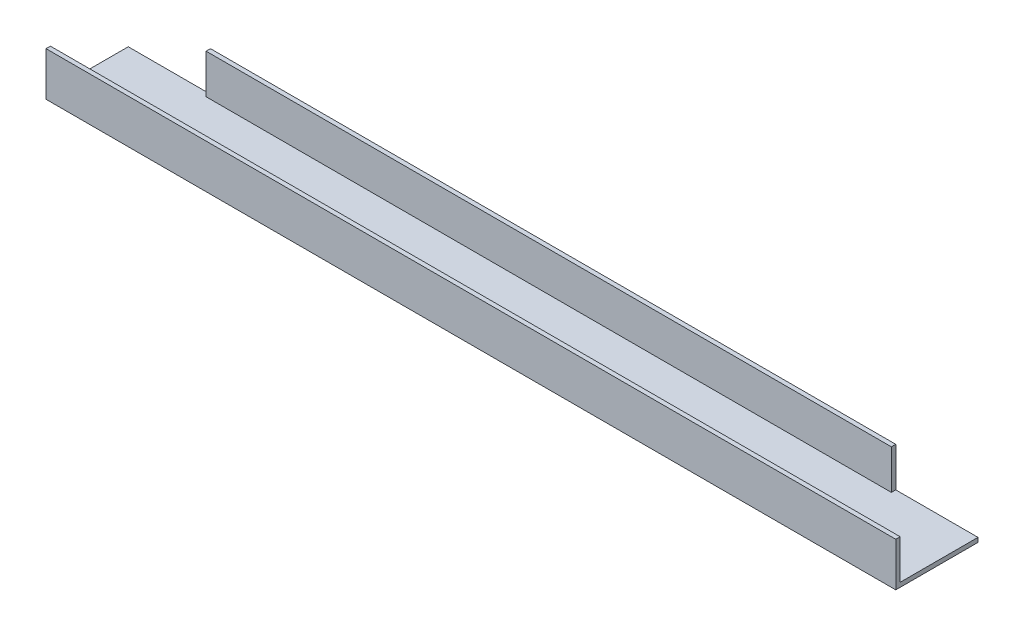
ISO-10303-21;
HEADER;
FILE_DESCRIPTION(('STEP AP214'),'2;1');
FILE_NAME('part.step','',(''),(''),'','','');
FILE_SCHEMA(('AUTOMOTIVE_DESIGN { 1 0 10303 214 1 1 1 1 }'));
ENDSEC;
DATA;
#1=APPLICATION_CONTEXT('core data for automotive mechanical design processes');
#2=APPLICATION_PROTOCOL_DEFINITION('international standard','automotive_design',2000,#1);
#3=PRODUCT_CONTEXT('',#1,'mechanical');
#4=PRODUCT('Part','Part','',(#3));
#5=PRODUCT_RELATED_PRODUCT_CATEGORY('part','',(#4));
#6=PRODUCT_DEFINITION_FORMATION('','',#4);
#7=PRODUCT_DEFINITION_CONTEXT('part definition',#1,'design');
#8=PRODUCT_DEFINITION('design','',#6,#7);
#9=PRODUCT_DEFINITION_SHAPE('','',#8);
#10=(LENGTH_UNIT() NAMED_UNIT(*) SI_UNIT(.MILLI.,.METRE.));
#11=(NAMED_UNIT(*) PLANE_ANGLE_UNIT() SI_UNIT($,.RADIAN.));
#12=(NAMED_UNIT(*) SI_UNIT($,.STERADIAN.) SOLID_ANGLE_UNIT());
#13=UNCERTAINTY_MEASURE_WITH_UNIT(LENGTH_MEASURE(1.E-05),#10,'distance_accuracy_value','');
#14=(GEOMETRIC_REPRESENTATION_CONTEXT(3) GLOBAL_UNCERTAINTY_ASSIGNED_CONTEXT((#13)) GLOBAL_UNIT_ASSIGNED_CONTEXT((#10,
#11,#12)) REPRESENTATION_CONTEXT('',''));
#15=CARTESIAN_POINT('',(0.,0.,0.));
#16=DIRECTION('',(0.,0.,1.));
#17=DIRECTION('',(1.,0.,0.));
#18=AXIS2_PLACEMENT_3D('',#15,#16,#17);
#19=CARTESIAN_POINT('',(0.,4.,0.));
#20=DIRECTION('',(0.,-1.,0.));
#21=DIRECTION('',(0.,0.,-1.));
#22=AXIS2_PLACEMENT_3D('',#19,#20,#21);
#23=PLANE('',#22);
#24=DIRECTION('',(0.,0.,-1.));
#25=VECTOR('',#24,1.);
#26=CARTESIAN_POINT('',(700.,4.,-75.));
#27=LINE('',#26,#25);
#28=CARTESIAN_POINT('',(700.,4.,-71.));
#29=VERTEX_POINT('',#28);
#30=CARTESIAN_POINT('',(700.,4.,-75.));
#31=VERTEX_POINT('',#30);
#32=EDGE_CURVE('E61',#29,#31,#27,.T.);
#33=ORIENTED_EDGE('',*,*,#32,.F.);
#34=DIRECTION('',(1.,0.,0.));
#35=VECTOR('',#34,1.);
#36=CARTESIAN_POINT('',(700.,4.,-71.));
#37=LINE('',#36,#35);
#38=CARTESIAN_POINT('',(75.,4.,-70.9999999999999));
#39=VERTEX_POINT('',#38);
#40=EDGE_CURVE('E65',#39,#29,#37,.T.);
#41=ORIENTED_EDGE('',*,*,#40,.F.);
#42=DIRECTION('',(0.,0.,1.));
#43=VECTOR('',#42,1.);
#44=CARTESIAN_POINT('',(75.,4.,-74.9999999999999));
#45=LINE('',#44,#43);
#46=CARTESIAN_POINT('',(75.,4.,-74.9999999999999));
#47=VERTEX_POINT('',#46);
#48=EDGE_CURVE('E134',#47,#39,#45,.T.);
#49=ORIENTED_EDGE('',*,*,#48,.F.);
#50=DIRECTION('',(-1.,0.,0.));
#51=VECTOR('',#50,1.);
#52=CARTESIAN_POINT('',(0.,4.,-75.));
#53=LINE('',#52,#51);
#54=CARTESIAN_POINT('',(0.,4.,-75.));
#55=VERTEX_POINT('',#54);
#56=EDGE_CURVE('E122',#47,#55,#53,.T.);
#57=ORIENTED_EDGE('',*,*,#56,.T.);
#58=DIRECTION('',(0.,0.,1.));
#59=VECTOR('',#58,1.);
#60=CARTESIAN_POINT('',(0.,4.,0.));
#61=LINE('',#60,#59);
#62=CARTESIAN_POINT('',(0.,4.,-4.));
#63=VERTEX_POINT('',#62);
#64=EDGE_CURVE('E199',#55,#63,#61,.T.);
#65=ORIENTED_EDGE('',*,*,#64,.T.);
#66=DIRECTION('',(-1.,0.,0.));
#67=VECTOR('',#66,1.);
#68=CARTESIAN_POINT('',(0.,4.,-4.));
#69=LINE('',#68,#67);
#70=CARTESIAN_POINT('',(775.,4.,-4.));
#71=VERTEX_POINT('',#70);
#72=EDGE_CURVE('E162',#71,#63,#69,.T.);
#73=ORIENTED_EDGE('',*,*,#72,.F.);
#74=DIRECTION('',(0.,0.,-1.));
#75=VECTOR('',#74,1.);
#76=CARTESIAN_POINT('',(775.,4.,0.));
#77=LINE('',#76,#75);
#78=CARTESIAN_POINT('',(775.,4.,-75.));
#79=VERTEX_POINT('',#78);
#80=EDGE_CURVE('E132',#71,#79,#77,.T.);
#81=ORIENTED_EDGE('',*,*,#80,.T.);
#82=EDGE_CURVE('E131',#79,#31,#53,.T.);
#83=ORIENTED_EDGE('',*,*,#82,.T.);
#84=EDGE_LOOP('',(#33,#41,#49,#57,#65,#73,#81,#83));
#85=FACE_BOUND('',#84,.T.);
#86=ADVANCED_FACE('F45',(#85),#23,.F.);
#87=CARTESIAN_POINT('',(0.,4.,0.));
#88=DIRECTION('',(1.,0.,0.));
#89=DIRECTION('',(0.,0.,-1.));
#90=AXIS2_PLACEMENT_3D('',#87,#88,#89);
#91=PLANE('',#90);
#92=DIRECTION('',(0.,0.,1.));
#93=VECTOR('',#92,1.);
#94=CARTESIAN_POINT('',(0.,0.,0.));
#95=LINE('',#94,#93);
#96=CARTESIAN_POINT('',(0.,0.,-75.));
#97=VERTEX_POINT('',#96);
#98=CARTESIAN_POINT('',(0.,0.,0.));
#99=VERTEX_POINT('',#98);
#100=EDGE_CURVE('E198',#97,#99,#95,.T.);
#101=ORIENTED_EDGE('',*,*,#100,.T.);
#102=DIRECTION('',(0.,-1.,0.));
#103=VECTOR('',#102,1.);
#104=CARTESIAN_POINT('',(0.,4.,0.));
#105=LINE('',#104,#103);
#106=CARTESIAN_POINT('',(0.,40.,0.));
#107=VERTEX_POINT('',#106);
#108=EDGE_CURVE('E11',#107,#99,#105,.T.);
#109=ORIENTED_EDGE('',*,*,#108,.F.);
#110=DIRECTION('',(0.,0.,1.));
#111=VECTOR('',#110,1.);
#112=CARTESIAN_POINT('',(0.,40.,0.));
#113=LINE('',#112,#111);
#114=CARTESIAN_POINT('',(0.,40.,-4.));
#115=VERTEX_POINT('',#114);
#116=EDGE_CURVE('E173',#115,#107,#113,.T.);
#117=ORIENTED_EDGE('',*,*,#116,.F.);
#118=DIRECTION('',(0.,-1.,0.));
#119=VECTOR('',#118,1.);
#120=CARTESIAN_POINT('',(0.,40.,-4.));
#121=LINE('',#120,#119);
#122=EDGE_CURVE('E187',#115,#63,#121,.T.);
#123=ORIENTED_EDGE('',*,*,#122,.T.);
#124=ORIENTED_EDGE('',*,*,#64,.F.);
#125=DIRECTION('',(0.,-1.,0.));
#126=VECTOR('',#125,1.);
#127=CARTESIAN_POINT('',(0.,4.,-75.));
#128=LINE('',#127,#126);
#129=EDGE_CURVE('E128',#55,#97,#128,.T.);
#130=ORIENTED_EDGE('',*,*,#129,.T.);
#131=EDGE_LOOP('',(#101,#109,#117,#123,#124,#130));
#132=FACE_BOUND('',#131,.T.);
#133=ADVANCED_FACE('F47',(#132),#91,.F.);
#134=CARTESIAN_POINT('',(0.,4.,0.));
#135=DIRECTION('',(0.,0.,-1.));
#136=DIRECTION('',(-1.,0.,0.));
#137=AXIS2_PLACEMENT_3D('',#134,#135,#136);
#138=PLANE('',#137);
#139=DIRECTION('',(1.,0.,0.));
#140=VECTOR('',#139,1.);
#141=CARTESIAN_POINT('',(0.,0.,0.));
#142=LINE('',#141,#140);
#143=CARTESIAN_POINT('',(775.,0.,0.));
#144=VERTEX_POINT('',#143);
#145=EDGE_CURVE('E209',#99,#144,#142,.T.);
#146=ORIENTED_EDGE('',*,*,#145,.T.);
#147=DIRECTION('',(0.,-1.,0.));
#148=VECTOR('',#147,1.);
#149=CARTESIAN_POINT('',(775.,4.,0.));
#150=LINE('',#149,#148);
#151=CARTESIAN_POINT('',(775.,40.,0.));
#152=VERTEX_POINT('',#151);
#153=EDGE_CURVE('E54',#152,#144,#150,.T.);
#154=ORIENTED_EDGE('',*,*,#153,.F.);
#155=DIRECTION('',(1.,0.,0.));
#156=VECTOR('',#155,1.);
#157=CARTESIAN_POINT('',(0.,40.,0.));
#158=LINE('',#157,#156);
#159=EDGE_CURVE('E177',#107,#152,#158,.T.);
#160=ORIENTED_EDGE('',*,*,#159,.F.);
#161=ORIENTED_EDGE('',*,*,#108,.T.);
#162=EDGE_LOOP('',(#146,#154,#160,#161));
#163=FACE_BOUND('',#162,.T.);
#164=ADVANCED_FACE('F267',(#163),#138,.F.);
#165=CARTESIAN_POINT('',(775.,4.,0.));
#166=DIRECTION('',(-1.,0.,0.));
#167=DIRECTION('',(0.,0.,1.));
#168=AXIS2_PLACEMENT_3D('',#165,#166,#167);
#169=PLANE('',#168);
#170=DIRECTION('',(0.,0.,-1.));
#171=VECTOR('',#170,1.);
#172=CARTESIAN_POINT('',(775.,0.,0.));
#173=LINE('',#172,#171);
#174=CARTESIAN_POINT('',(775.,0.,-75.));
#175=VERTEX_POINT('',#174);
#176=EDGE_CURVE('E212',#144,#175,#173,.T.);
#177=ORIENTED_EDGE('',*,*,#176,.T.);
#178=DIRECTION('',(0.,-1.,0.));
#179=VECTOR('',#178,1.);
#180=CARTESIAN_POINT('',(775.,4.,-75.));
#181=LINE('',#180,#179);
#182=EDGE_CURVE('E219',#79,#175,#181,.T.);
#183=ORIENTED_EDGE('',*,*,#182,.F.);
#184=ORIENTED_EDGE('',*,*,#80,.F.);
#185=DIRECTION('',(0.,-1.,0.));
#186=VECTOR('',#185,1.);
#187=CARTESIAN_POINT('',(775.,40.,-4.));
#188=LINE('',#187,#186);
#189=CARTESIAN_POINT('',(775.,40.,-4.));
#190=VERTEX_POINT('',#189);
#191=EDGE_CURVE('E194',#190,#71,#188,.T.);
#192=ORIENTED_EDGE('',*,*,#191,.F.);
#193=DIRECTION('',(0.,0.,-1.));
#194=VECTOR('',#193,1.);
#195=CARTESIAN_POINT('',(775.,40.,0.));
#196=LINE('',#195,#194);
#197=EDGE_CURVE('E181',#152,#190,#196,.T.);
#198=ORIENTED_EDGE('',*,*,#197,.F.);
#199=ORIENTED_EDGE('',*,*,#153,.T.);
#200=EDGE_LOOP('',(#177,#183,#184,#192,#198,#199));
#201=FACE_BOUND('',#200,.T.);
#202=ADVANCED_FACE('F227',(#201),#169,.F.);
#203=CARTESIAN_POINT('',(0.,4.,-75.));
#204=DIRECTION('',(0.,0.,1.));
#205=DIRECTION('',(1.,0.,0.));
#206=AXIS2_PLACEMENT_3D('',#203,#204,#205);
#207=PLANE('',#206);
#208=DIRECTION('',(-1.,0.,0.));
#209=VECTOR('',#208,1.);
#210=CARTESIAN_POINT('',(0.,0.,-75.));
#211=LINE('',#210,#209);
#212=EDGE_CURVE('E202',#175,#97,#211,.T.);
#213=ORIENTED_EDGE('',*,*,#212,.T.);
#214=ORIENTED_EDGE('',*,*,#129,.F.);
#215=ORIENTED_EDGE('',*,*,#56,.F.);
#216=DIRECTION('',(0.,-1.,0.));
#217=VECTOR('',#216,1.);
#218=CARTESIAN_POINT('',(75.,40.,-74.9999999999999));
#219=LINE('',#218,#217);
#220=CARTESIAN_POINT('',(75.,40.,-74.9999999999999));
#221=VERTEX_POINT('',#220);
#222=EDGE_CURVE('E125',#221,#47,#219,.T.);
#223=ORIENTED_EDGE('',*,*,#222,.F.);
#224=DIRECTION('',(-1.,0.,0.));
#225=VECTOR('',#224,1.);
#226=CARTESIAN_POINT('',(700.,40.,-75.));
#227=LINE('',#226,#225);
#228=CARTESIAN_POINT('',(700.,40.,-75.));
#229=VERTEX_POINT('',#228);
#230=EDGE_CURVE('E167',#229,#221,#227,.T.);
#231=ORIENTED_EDGE('',*,*,#230,.F.);
#232=DIRECTION('',(0.,-1.,0.));
#233=VECTOR('',#232,1.);
#234=CARTESIAN_POINT('',(700.,40.,-75.));
#235=LINE('',#234,#233);
#236=EDGE_CURVE('E144',#229,#31,#235,.T.);
#237=ORIENTED_EDGE('',*,*,#236,.T.);
#238=ORIENTED_EDGE('',*,*,#82,.F.);
#239=ORIENTED_EDGE('',*,*,#182,.T.);
#240=EDGE_LOOP('',(#213,#214,#215,#223,#231,#237,#238,#239));
#241=FACE_BOUND('',#240,.T.);
#242=ADVANCED_FACE('F123',(#241),#207,.F.);
#243=CARTESIAN_POINT('',(0.,0.,0.));
#244=DIRECTION('',(0.,-1.,0.));
#245=DIRECTION('',(0.,0.,-1.));
#246=AXIS2_PLACEMENT_3D('',#243,#244,#245);
#247=PLANE('',#246);
#248=ORIENTED_EDGE('',*,*,#100,.F.);
#249=ORIENTED_EDGE('',*,*,#212,.F.);
#250=ORIENTED_EDGE('',*,*,#176,.F.);
#251=ORIENTED_EDGE('',*,*,#145,.F.);
#252=EDGE_LOOP('',(#248,#249,#250,#251));
#253=FACE_BOUND('',#252,.T.);
#254=ADVANCED_FACE('F235',(#253),#247,.T.);
#255=CARTESIAN_POINT('',(0.,40.,-4.));
#256=DIRECTION('',(0.,0.,1.));
#257=DIRECTION('',(1.,0.,0.));
#258=AXIS2_PLACEMENT_3D('',#255,#256,#257);
#259=PLANE('',#258);
#260=ORIENTED_EDGE('',*,*,#72,.T.);
#261=ORIENTED_EDGE('',*,*,#122,.F.);
#262=DIRECTION('',(-1.,0.,0.));
#263=VECTOR('',#262,1.);
#264=CARTESIAN_POINT('',(0.,40.,-4.));
#265=LINE('',#264,#263);
#266=EDGE_CURVE('E184',#190,#115,#265,.T.);
#267=ORIENTED_EDGE('',*,*,#266,.F.);
#268=ORIENTED_EDGE('',*,*,#191,.T.);
#269=EDGE_LOOP('',(#260,#261,#267,#268));
#270=FACE_BOUND('',#269,.T.);
#271=ADVANCED_FACE('F242',(#270),#259,.F.);
#272=CARTESIAN_POINT('',(0.,40.,0.));
#273=DIRECTION('',(0.,-1.,0.));
#274=DIRECTION('',(0.,0.,-1.));
#275=AXIS2_PLACEMENT_3D('',#272,#273,#274);
#276=PLANE('',#275);
#277=ORIENTED_EDGE('',*,*,#116,.T.);
#278=ORIENTED_EDGE('',*,*,#159,.T.);
#279=ORIENTED_EDGE('',*,*,#197,.T.);
#280=ORIENTED_EDGE('',*,*,#266,.T.);
#281=EDGE_LOOP('',(#277,#278,#279,#280));
#282=FACE_BOUND('',#281,.T.);
#283=ADVANCED_FACE('F278',(#282),#276,.F.);
#284=CARTESIAN_POINT('',(700.,40.,-75.));
#285=DIRECTION('',(-1.,0.,0.));
#286=DIRECTION('',(0.,0.,1.));
#287=AXIS2_PLACEMENT_3D('',#284,#285,#286);
#288=PLANE('',#287);
#289=ORIENTED_EDGE('',*,*,#32,.T.);
#290=ORIENTED_EDGE('',*,*,#236,.F.);
#291=DIRECTION('',(0.,0.,-1.));
#292=VECTOR('',#291,1.);
#293=CARTESIAN_POINT('',(700.,40.,-75.));
#294=LINE('',#293,#292);
#295=CARTESIAN_POINT('',(700.,40.,-71.));
#296=VERTEX_POINT('',#295);
#297=EDGE_CURVE('E158',#296,#229,#294,.T.);
#298=ORIENTED_EDGE('',*,*,#297,.F.);
#299=DIRECTION('',(0.,-1.,0.));
#300=VECTOR('',#299,1.);
#301=CARTESIAN_POINT('',(700.,40.,-71.));
#302=LINE('',#301,#300);
#303=EDGE_CURVE('E148',#296,#29,#302,.T.);
#304=ORIENTED_EDGE('',*,*,#303,.T.);
#305=EDGE_LOOP('',(#289,#290,#298,#304));
#306=FACE_BOUND('',#305,.T.);
#307=ADVANCED_FACE('F247',(#306),#288,.F.);
#308=CARTESIAN_POINT('',(75.,40.,-74.9999999999999));
#309=DIRECTION('',(1.,0.,0.));
#310=DIRECTION('',(0.,0.,-1.));
#311=AXIS2_PLACEMENT_3D('',#308,#309,#310);
#312=PLANE('',#311);
#313=ORIENTED_EDGE('',*,*,#48,.T.);
#314=DIRECTION('',(0.,-1.,0.));
#315=VECTOR('',#314,1.);
#316=CARTESIAN_POINT('',(75.,40.,-70.9999999999999));
#317=LINE('',#316,#315);
#318=CARTESIAN_POINT('',(75.,40.,-70.9999999999999));
#319=VERTEX_POINT('',#318);
#320=EDGE_CURVE('E143',#319,#39,#317,.T.);
#321=ORIENTED_EDGE('',*,*,#320,.F.);
#322=DIRECTION('',(0.,0.,1.));
#323=VECTOR('',#322,1.);
#324=CARTESIAN_POINT('',(75.,40.,-74.9999999999999));
#325=LINE('',#324,#323);
#326=EDGE_CURVE('E141',#221,#319,#325,.T.);
#327=ORIENTED_EDGE('',*,*,#326,.F.);
#328=ORIENTED_EDGE('',*,*,#222,.T.);
#329=EDGE_LOOP('',(#313,#321,#327,#328));
#330=FACE_BOUND('',#329,.T.);
#331=ADVANCED_FACE('F140',(#330),#312,.F.);
#332=CARTESIAN_POINT('',(700.,40.,-71.));
#333=DIRECTION('',(0.,0.,-1.));
#334=DIRECTION('',(-1.,0.,0.));
#335=AXIS2_PLACEMENT_3D('',#332,#333,#334);
#336=PLANE('',#335);
#337=ORIENTED_EDGE('',*,*,#40,.T.);
#338=ORIENTED_EDGE('',*,*,#303,.F.);
#339=DIRECTION('',(1.,0.,0.));
#340=VECTOR('',#339,1.);
#341=CARTESIAN_POINT('',(700.,40.,-71.));
#342=LINE('',#341,#340);
#343=EDGE_CURVE('E156',#319,#296,#342,.T.);
#344=ORIENTED_EDGE('',*,*,#343,.F.);
#345=ORIENTED_EDGE('',*,*,#320,.T.);
#346=EDGE_LOOP('',(#337,#338,#344,#345));
#347=FACE_BOUND('',#346,.T.);
#348=ADVANCED_FACE('F251',(#347),#336,.F.);
#349=CARTESIAN_POINT('',(0.,40.,0.));
#350=DIRECTION('',(0.,-1.,0.));
#351=DIRECTION('',(0.,0.,-1.));
#352=AXIS2_PLACEMENT_3D('',#349,#350,#351);
#353=PLANE('',#352);
#354=ORIENTED_EDGE('',*,*,#297,.T.);
#355=ORIENTED_EDGE('',*,*,#230,.T.);
#356=ORIENTED_EDGE('',*,*,#326,.T.);
#357=ORIENTED_EDGE('',*,*,#343,.T.);
#358=EDGE_LOOP('',(#354,#355,#356,#357));
#359=FACE_BOUND('',#358,.T.);
#360=ADVANCED_FACE('F253',(#359),#353,.F.);
#361=CLOSED_SHELL('',(#86,#133,#164,#202,#242,#254,#271,#283,#307,#331,#348,#360));
#362=MANIFOLD_SOLID_BREP('B2',#361);
#363=ADVANCED_BREP_SHAPE_REPRESENTATION('',(#18,#362),#14);
#364=SHAPE_DEFINITION_REPRESENTATION(#9,#363);
ENDSEC;
END-ISO-10303-21;
